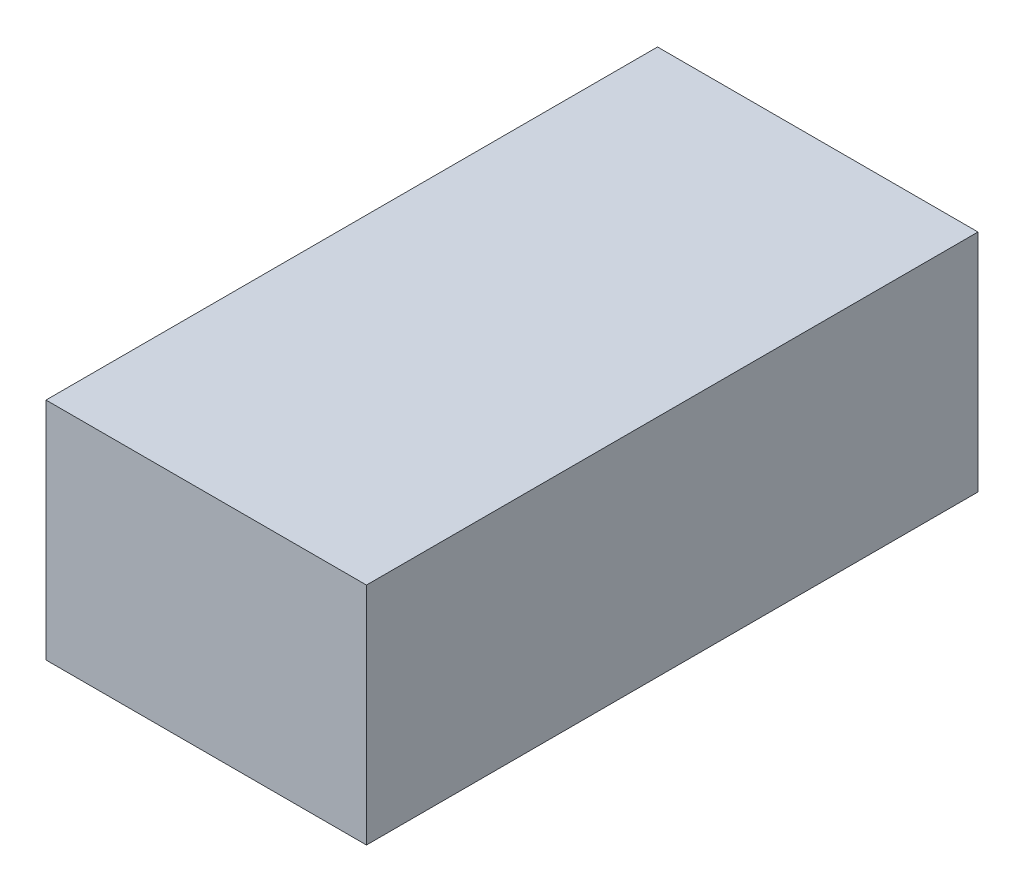
ISO-10303-21;
HEADER;
FILE_DESCRIPTION(('STEP AP214'),'2;1');
FILE_NAME('part.step','',(''),(''),'','','');
FILE_SCHEMA(('AUTOMOTIVE_DESIGN { 1 0 10303 214 1 1 1 1 }'));
ENDSEC;
DATA;
#1=APPLICATION_CONTEXT('core data for automotive mechanical design processes');
#2=APPLICATION_PROTOCOL_DEFINITION('international standard','automotive_design',2000,#1);
#3=PRODUCT_CONTEXT('',#1,'mechanical');
#4=PRODUCT('Part','Part','',(#3));
#5=PRODUCT_RELATED_PRODUCT_CATEGORY('part','',(#4));
#6=PRODUCT_DEFINITION_FORMATION('','',#4);
#7=PRODUCT_DEFINITION_CONTEXT('part definition',#1,'design');
#8=PRODUCT_DEFINITION('design','',#6,#7);
#9=PRODUCT_DEFINITION_SHAPE('','',#8);
#10=(LENGTH_UNIT() NAMED_UNIT(*) SI_UNIT(.MILLI.,.METRE.));
#11=(NAMED_UNIT(*) PLANE_ANGLE_UNIT() SI_UNIT($,.RADIAN.));
#12=(NAMED_UNIT(*) SI_UNIT($,.STERADIAN.) SOLID_ANGLE_UNIT());
#13=UNCERTAINTY_MEASURE_WITH_UNIT(LENGTH_MEASURE(1.E-05),#10,'distance_accuracy_value','');
#14=(GEOMETRIC_REPRESENTATION_CONTEXT(3) GLOBAL_UNCERTAINTY_ASSIGNED_CONTEXT((#13)) GLOBAL_UNIT_ASSIGNED_CONTEXT((#10,
#11,#12)) REPRESENTATION_CONTEXT('',''));
#15=CARTESIAN_POINT('',(0.,0.,0.));
#16=DIRECTION('',(0.,0.,1.));
#17=DIRECTION('',(1.,0.,0.));
#18=AXIS2_PLACEMENT_3D('',#15,#16,#17);
#19=CARTESIAN_POINT('',(-5.82867087928207E-13,-119.,184.381683654322));
#20=DIRECTION('',(0.,-1.,0.));
#21=DIRECTION('',(0.,0.,1.));
#22=AXIS2_PLACEMENT_3D('',#19,#20,#21);
#23=PLANE('',#22);
#24=DIRECTION('',(0.,0.,-1.));
#25=VECTOR('',#24,1.);
#26=CARTESIAN_POINT('',(135.499999999999,-119.000000000002,184.381683654322));
#27=LINE('',#26,#25);
#28=CARTESIAN_POINT('',(135.499999999999,-119.000000000002,442.95));
#29=VERTEX_POINT('',#28);
#30=CARTESIAN_POINT('',(135.499999999999,-119.000000000002,-74.1866326913554));
#31=VERTEX_POINT('',#30);
#32=EDGE_CURVE('E10',#29,#31,#27,.T.);
#33=ORIENTED_EDGE('',*,*,#32,.F.);
#34=DIRECTION('',(1.,0.,0.));
#35=VECTOR('',#34,1.);
#36=CARTESIAN_POINT('',(-5.82867087928207E-13,-119.,442.95));
#37=LINE('',#36,#35);
#38=CARTESIAN_POINT('',(-135.500000000001,-118.999999999999,442.95));
#39=VERTEX_POINT('',#38);
#40=EDGE_CURVE('E60',#39,#29,#37,.T.);
#41=ORIENTED_EDGE('',*,*,#40,.F.);
#42=DIRECTION('',(0.,0.,1.));
#43=VECTOR('',#42,1.);
#44=CARTESIAN_POINT('',(-135.500000000001,-118.999999999999,184.381683654322));
#45=LINE('',#44,#43);
#46=CARTESIAN_POINT('',(-135.500000000001,-118.999999999999,-74.1866326913554));
#47=VERTEX_POINT('',#46);
#48=EDGE_CURVE('E86',#47,#39,#45,.T.);
#49=ORIENTED_EDGE('',*,*,#48,.F.);
#50=DIRECTION('',(-1.,0.,0.));
#51=VECTOR('',#50,1.);
#52=CARTESIAN_POINT('',(-5.82867087928207E-13,-119.,-74.1866326913554));
#53=LINE('',#52,#51);
#54=EDGE_CURVE('E23',#31,#47,#53,.T.);
#55=ORIENTED_EDGE('',*,*,#54,.F.);
#56=EDGE_LOOP('',(#33,#41,#49,#55));
#57=FACE_BOUND('',#56,.T.);
#58=ADVANCED_FACE('F16',(#57),#23,.T.);
#59=CARTESIAN_POINT('',(135.500000000002,71.3999999999983,184.381683654322));
#60=DIRECTION('',(1.,0.,0.));
#61=DIRECTION('',(0.,1.,0.));
#62=AXIS2_PLACEMENT_3D('',#59,#60,#61);
#63=PLANE('',#62);
#64=DIRECTION('',(0.,-1.,0.));
#65=VECTOR('',#64,1.);
#66=CARTESIAN_POINT('',(135.500000000002,71.3999999999983,442.95));
#67=LINE('',#66,#65);
#68=CARTESIAN_POINT('',(135.500000000002,71.3999999999983,442.95));
#69=VERTEX_POINT('',#68);
#70=EDGE_CURVE('E53',#69,#29,#67,.T.);
#71=ORIENTED_EDGE('',*,*,#70,.T.);
#72=ORIENTED_EDGE('',*,*,#32,.T.);
#73=DIRECTION('',(0.,-1.,0.));
#74=VECTOR('',#73,1.);
#75=CARTESIAN_POINT('',(135.500000000002,71.3999999999983,-74.1866326913554));
#76=LINE('',#75,#74);
#77=CARTESIAN_POINT('',(135.500000000002,71.3999999999983,-74.1866326913554));
#78=VERTEX_POINT('',#77);
#79=EDGE_CURVE('E66',#78,#31,#76,.T.);
#80=ORIENTED_EDGE('',*,*,#79,.F.);
#81=DIRECTION('',(0.,0.,1.));
#82=VECTOR('',#81,1.);
#83=CARTESIAN_POINT('',(135.500000000002,71.3999999999983,184.381683654322));
#84=LINE('',#83,#82);
#85=EDGE_CURVE('E64',#78,#69,#84,.T.);
#86=ORIENTED_EDGE('',*,*,#85,.T.);
#87=EDGE_LOOP('',(#71,#72,#80,#86));
#88=FACE_BOUND('',#87,.T.);
#89=ADVANCED_FACE('F65',(#88),#63,.T.);
#90=CARTESIAN_POINT('',(1.85962356624714E-12,71.4,-74.1866326913554));
#91=DIRECTION('',(0.,0.,-1.));
#92=DIRECTION('',(0.,-1.,0.));
#93=AXIS2_PLACEMENT_3D('',#90,#91,#92);
#94=PLANE('',#93);
#95=ORIENTED_EDGE('',*,*,#79,.T.);
#96=ORIENTED_EDGE('',*,*,#54,.T.);
#97=DIRECTION('',(0.,-1.,0.));
#98=VECTOR('',#97,1.);
#99=CARTESIAN_POINT('',(-135.499999999998,71.4000000000018,-74.1866326913554));
#100=LINE('',#99,#98);
#101=CARTESIAN_POINT('',(-135.499999999998,71.4000000000018,-74.1866326913554));
#102=VERTEX_POINT('',#101);
#103=EDGE_CURVE('E81',#102,#47,#100,.T.);
#104=ORIENTED_EDGE('',*,*,#103,.F.);
#105=DIRECTION('',(1.,0.,0.));
#106=VECTOR('',#105,1.);
#107=CARTESIAN_POINT('',(1.85962356624714E-12,71.4,-74.1866326913554));
#108=LINE('',#107,#106);
#109=EDGE_CURVE('E70',#102,#78,#108,.T.);
#110=ORIENTED_EDGE('',*,*,#109,.T.);
#111=EDGE_LOOP('',(#95,#96,#104,#110));
#112=FACE_BOUND('',#111,.T.);
#113=ADVANCED_FACE('F90',(#112),#94,.T.);
#114=CARTESIAN_POINT('',(-135.499999999998,71.4000000000018,184.381683654322));
#115=DIRECTION('',(-1.,0.,0.));
#116=DIRECTION('',(0.,-1.,0.));
#117=AXIS2_PLACEMENT_3D('',#114,#115,#116);
#118=PLANE('',#117);
#119=ORIENTED_EDGE('',*,*,#103,.T.);
#120=ORIENTED_EDGE('',*,*,#48,.T.);
#121=DIRECTION('',(0.,-1.,0.));
#122=VECTOR('',#121,1.);
#123=CARTESIAN_POINT('',(-135.499999999998,71.4000000000018,442.95));
#124=LINE('',#123,#122);
#125=CARTESIAN_POINT('',(-135.499999999998,71.4000000000018,442.95));
#126=VERTEX_POINT('',#125);
#127=EDGE_CURVE('E61',#126,#39,#124,.T.);
#128=ORIENTED_EDGE('',*,*,#127,.F.);
#129=DIRECTION('',(0.,0.,-1.));
#130=VECTOR('',#129,1.);
#131=CARTESIAN_POINT('',(-135.499999999998,71.4000000000018,184.381683654322));
#132=LINE('',#131,#130);
#133=EDGE_CURVE('E75',#126,#102,#132,.T.);
#134=ORIENTED_EDGE('',*,*,#133,.T.);
#135=EDGE_LOOP('',(#119,#120,#128,#134));
#136=FACE_BOUND('',#135,.T.);
#137=ADVANCED_FACE('F88',(#136),#118,.T.);
#138=CARTESIAN_POINT('',(1.85962356624714E-12,71.4,184.381683654322));
#139=DIRECTION('',(0.,1.,0.));
#140=DIRECTION('',(0.,0.,-1.));
#141=AXIS2_PLACEMENT_3D('',#138,#139,#140);
#142=PLANE('',#141);
#143=DIRECTION('',(-1.,0.,0.));
#144=VECTOR('',#143,1.);
#145=CARTESIAN_POINT('',(1.85962356624714E-12,71.4,442.95));
#146=LINE('',#145,#144);
#147=EDGE_CURVE('E58',#69,#126,#146,.T.);
#148=ORIENTED_EDGE('',*,*,#147,.F.);
#149=ORIENTED_EDGE('',*,*,#85,.F.);
#150=ORIENTED_EDGE('',*,*,#109,.F.);
#151=ORIENTED_EDGE('',*,*,#133,.F.);
#152=EDGE_LOOP('',(#148,#149,#150,#151));
#153=FACE_BOUND('',#152,.T.);
#154=ADVANCED_FACE('F73',(#153),#142,.T.);
#155=CARTESIAN_POINT('',(1.85962356624714E-12,71.4,442.95));
#156=DIRECTION('',(0.,0.,1.));
#157=DIRECTION('',(0.,1.,0.));
#158=AXIS2_PLACEMENT_3D('',#155,#156,#157);
#159=PLANE('',#158);
#160=ORIENTED_EDGE('',*,*,#147,.T.);
#161=ORIENTED_EDGE('',*,*,#127,.T.);
#162=ORIENTED_EDGE('',*,*,#40,.T.);
#163=ORIENTED_EDGE('',*,*,#70,.F.);
#164=EDGE_LOOP('',(#160,#161,#162,#163));
#165=FACE_BOUND('',#164,.T.);
#166=ADVANCED_FACE('F55',(#165),#159,.T.);
#167=CLOSED_SHELL('',(#58,#89,#113,#137,#154,#166));
#168=MANIFOLD_SOLID_BREP('B1',#167);
#169=ADVANCED_BREP_SHAPE_REPRESENTATION('',(#18,#168),#14);
#170=SHAPE_DEFINITION_REPRESENTATION(#9,#169);
ENDSEC;
END-ISO-10303-21;
